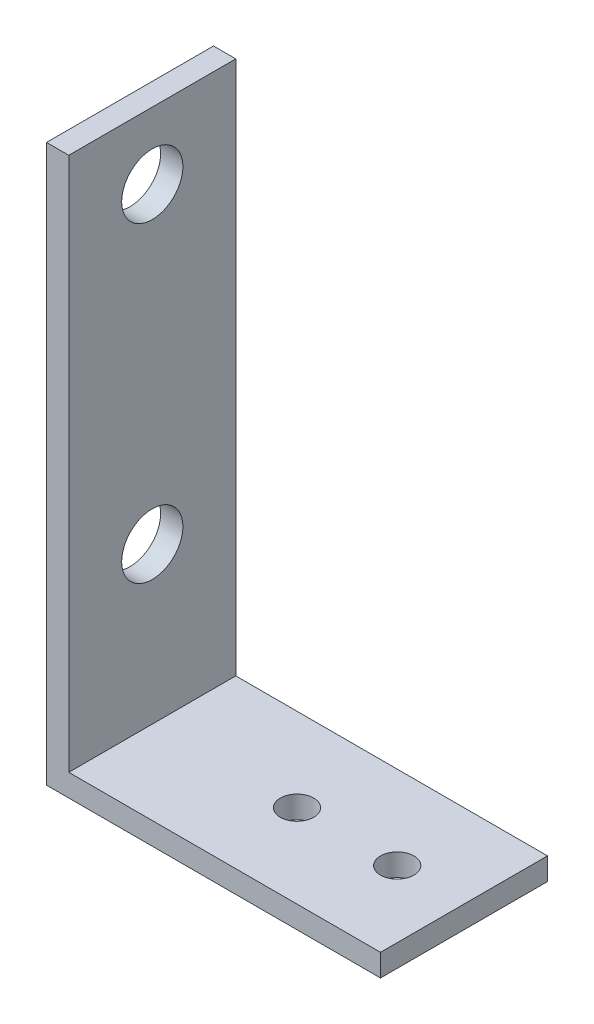
ISO-10303-21;
HEADER;
FILE_DESCRIPTION(('STEP AP214'),'2;1');
FILE_NAME('part.step','',(''),(''),'','','');
FILE_SCHEMA(('AUTOMOTIVE_DESIGN { 1 0 10303 214 1 1 1 1 }'));
ENDSEC;
DATA;
#1=APPLICATION_CONTEXT('core data for automotive mechanical design processes');
#2=APPLICATION_PROTOCOL_DEFINITION('international standard','automotive_design',2000,#1);
#3=PRODUCT_CONTEXT('',#1,'mechanical');
#4=PRODUCT('Part','Part','',(#3));
#5=PRODUCT_RELATED_PRODUCT_CATEGORY('part','',(#4));
#6=PRODUCT_DEFINITION_FORMATION('','',#4);
#7=PRODUCT_DEFINITION_CONTEXT('part definition',#1,'design');
#8=PRODUCT_DEFINITION('design','',#6,#7);
#9=PRODUCT_DEFINITION_SHAPE('','',#8);
#10=(LENGTH_UNIT() NAMED_UNIT(*) SI_UNIT(.MILLI.,.METRE.));
#11=(NAMED_UNIT(*) PLANE_ANGLE_UNIT() SI_UNIT($,.RADIAN.));
#12=(NAMED_UNIT(*) SI_UNIT($,.STERADIAN.) SOLID_ANGLE_UNIT());
#13=UNCERTAINTY_MEASURE_WITH_UNIT(LENGTH_MEASURE(1.E-05),#10,'distance_accuracy_value','');
#14=(GEOMETRIC_REPRESENTATION_CONTEXT(3) GLOBAL_UNCERTAINTY_ASSIGNED_CONTEXT((#13)) GLOBAL_UNIT_ASSIGNED_CONTEXT((#10,
#11,#12)) REPRESENTATION_CONTEXT('',''));
#15=CARTESIAN_POINT('',(0.,0.,0.));
#16=DIRECTION('',(0.,0.,1.));
#17=DIRECTION('',(1.,0.,0.));
#18=AXIS2_PLACEMENT_3D('',#15,#16,#17);
#19=CARTESIAN_POINT('',(0.,2.,15.));
#20=DIRECTION('',(-1.,0.,0.));
#21=DIRECTION('',(0.,-1.,0.));
#22=AXIS2_PLACEMENT_3D('',#19,#20,#21);
#23=PLANE('',#22);
#24=DIRECTION('',(0.,1.,0.));
#25=VECTOR('',#24,1.);
#26=CARTESIAN_POINT('',(0.,2.,0.));
#27=LINE('',#26,#25);
#28=CARTESIAN_POINT('',(0.,0.,0.));
#29=VERTEX_POINT('',#28);
#30=CARTESIAN_POINT('',(0.,2.,0.));
#31=VERTEX_POINT('',#30);
#32=EDGE_CURVE('E117',#29,#31,#27,.T.);
#33=ORIENTED_EDGE('',*,*,#32,.T.);
#34=DIRECTION('',(0.,0.,-1.));
#35=VECTOR('',#34,1.);
#36=CARTESIAN_POINT('',(0.,2.,15.));
#37=LINE('',#36,#35);
#38=CARTESIAN_POINT('',(0.,2.,15.));
#39=VERTEX_POINT('',#38);
#40=EDGE_CURVE('E11',#39,#31,#37,.T.);
#41=ORIENTED_EDGE('',*,*,#40,.F.);
#42=DIRECTION('',(0.,1.,0.));
#43=VECTOR('',#42,1.);
#44=CARTESIAN_POINT('',(0.,2.,15.));
#45=LINE('',#44,#43);
#46=CARTESIAN_POINT('',(0.,0.,15.));
#47=VERTEX_POINT('',#46);
#48=EDGE_CURVE('E128',#47,#39,#45,.T.);
#49=ORIENTED_EDGE('',*,*,#48,.F.);
#50=DIRECTION('',(0.,0.,-1.));
#51=VECTOR('',#50,1.);
#52=CARTESIAN_POINT('',(0.,0.,15.));
#53=LINE('',#52,#51);
#54=EDGE_CURVE('E113',#47,#29,#53,.T.);
#55=ORIENTED_EDGE('',*,*,#54,.T.);
#56=EDGE_LOOP('',(#33,#41,#49,#55));
#57=FACE_BOUND('',#56,.T.);
#58=ADVANCED_FACE('F33',(#57),#23,.F.);
#59=CARTESIAN_POINT('',(-28.,1.99999999999999,15.));
#60=DIRECTION('',(0.,-1.,0.));
#61=DIRECTION('',(1.,0.,0.));
#62=AXIS2_PLACEMENT_3D('',#59,#60,#61);
#63=PLANE('',#62);
#64=CARTESIAN_POINT('',(-15.,1.99999999999999,7.5));
#65=DIRECTION('',(0.,-1.,0.));
#66=DIRECTION('',(1.,0.,0.));
#67=AXIS2_PLACEMENT_3D('',#64,#65,#66);
#68=CIRCLE('',#67,1.5);
#69=CARTESIAN_POINT('',(-13.5,1.99999999999999,7.5));
#70=VERTEX_POINT('',#69);
#71=EDGE_CURVE('E250',#70,#70,#68,.T.);
#72=ORIENTED_EDGE('',*,*,#71,.T.);
#73=EDGE_LOOP('',(#72));
#74=FACE_BOUND('',#73,.T.);
#75=CARTESIAN_POINT('',(-6.,1.99999999999999,7.5));
#76=DIRECTION('',(0.,-1.,0.));
#77=DIRECTION('',(1.,0.,0.));
#78=AXIS2_PLACEMENT_3D('',#75,#76,#77);
#79=CIRCLE('',#78,1.5);
#80=CARTESIAN_POINT('',(-4.5,1.99999999999999,7.5));
#81=VERTEX_POINT('',#80);
#82=EDGE_CURVE('E254',#81,#81,#79,.T.);
#83=ORIENTED_EDGE('',*,*,#82,.T.);
#84=EDGE_LOOP('',(#83));
#85=FACE_BOUND('',#84,.T.);
#86=DIRECTION('',(-1.,0.,0.));
#87=VECTOR('',#86,1.);
#88=CARTESIAN_POINT('',(-28.,1.99999999999999,0.));
#89=LINE('',#88,#87);
#90=CARTESIAN_POINT('',(-28.,1.99999999999999,0.));
#91=VERTEX_POINT('',#90);
#92=EDGE_CURVE('E120',#31,#91,#89,.T.);
#93=ORIENTED_EDGE('',*,*,#92,.T.);
#94=DIRECTION('',(0.,0.,-1.));
#95=VECTOR('',#94,1.);
#96=CARTESIAN_POINT('',(-28.,1.99999999999999,15.));
#97=LINE('',#96,#95);
#98=CARTESIAN_POINT('',(-28.,1.99999999999999,15.));
#99=VERTEX_POINT('',#98);
#100=EDGE_CURVE('E41',#99,#91,#97,.T.);
#101=ORIENTED_EDGE('',*,*,#100,.F.);
#102=DIRECTION('',(-1.,0.,0.));
#103=VECTOR('',#102,1.);
#104=CARTESIAN_POINT('',(-28.,1.99999999999999,15.));
#105=LINE('',#104,#103);
#106=EDGE_CURVE('E86',#39,#99,#105,.T.);
#107=ORIENTED_EDGE('',*,*,#106,.F.);
#108=ORIENTED_EDGE('',*,*,#40,.T.);
#109=EDGE_LOOP('',(#93,#101,#107,#108));
#110=FACE_BOUND('',#109,.T.);
#111=ADVANCED_FACE('F156',(#74,#85,#110),#63,.F.);
#112=CARTESIAN_POINT('',(-28.,50.,15.));
#113=DIRECTION('',(-1.,0.,0.));
#114=DIRECTION('',(0.,-1.,0.));
#115=AXIS2_PLACEMENT_3D('',#112,#113,#114);
#116=PLANE('',#115);
#117=CARTESIAN_POINT('',(-28.,16.,7.50000000000001));
#118=DIRECTION('',(-1.,0.,0.));
#119=DIRECTION('',(0.,-1.,0.));
#120=AXIS2_PLACEMENT_3D('',#117,#118,#119);
#121=CIRCLE('',#120,2.75);
#122=CARTESIAN_POINT('',(-28.,13.25,7.50000000000001));
#123=VERTEX_POINT('',#122);
#124=EDGE_CURVE('E263',#123,#123,#121,.T.);
#125=ORIENTED_EDGE('',*,*,#124,.T.);
#126=EDGE_LOOP('',(#125));
#127=FACE_BOUND('',#126,.T.);
#128=CARTESIAN_POINT('',(-28.,44.,7.5));
#129=DIRECTION('',(-1.,0.,0.));
#130=DIRECTION('',(0.,-1.,0.));
#131=AXIS2_PLACEMENT_3D('',#128,#129,#130);
#132=CIRCLE('',#131,2.75);
#133=CARTESIAN_POINT('',(-28.,41.25,7.5));
#134=VERTEX_POINT('',#133);
#135=EDGE_CURVE('E121',#134,#134,#132,.T.);
#136=ORIENTED_EDGE('',*,*,#135,.T.);
#137=EDGE_LOOP('',(#136));
#138=FACE_BOUND('',#137,.T.);
#139=DIRECTION('',(0.,1.,0.));
#140=VECTOR('',#139,1.);
#141=CARTESIAN_POINT('',(-28.,50.,0.));
#142=LINE('',#141,#140);
#143=CARTESIAN_POINT('',(-28.,50.,0.));
#144=VERTEX_POINT('',#143);
#145=EDGE_CURVE('E123',#91,#144,#142,.T.);
#146=ORIENTED_EDGE('',*,*,#145,.T.);
#147=DIRECTION('',(0.,0.,-1.));
#148=VECTOR('',#147,1.);
#149=CARTESIAN_POINT('',(-28.,50.,15.));
#150=LINE('',#149,#148);
#151=CARTESIAN_POINT('',(-28.,50.,15.));
#152=VERTEX_POINT('',#151);
#153=EDGE_CURVE('E108',#152,#144,#150,.T.);
#154=ORIENTED_EDGE('',*,*,#153,.F.);
#155=DIRECTION('',(0.,1.,0.));
#156=VECTOR('',#155,1.);
#157=CARTESIAN_POINT('',(-28.,50.,15.));
#158=LINE('',#157,#156);
#159=EDGE_CURVE('E99',#99,#152,#158,.T.);
#160=ORIENTED_EDGE('',*,*,#159,.F.);
#161=ORIENTED_EDGE('',*,*,#100,.T.);
#162=EDGE_LOOP('',(#146,#154,#160,#161));
#163=FACE_BOUND('',#162,.T.);
#164=ADVANCED_FACE('F134',(#127,#138,#163),#116,.F.);
#165=CARTESIAN_POINT('',(-30.,50.,15.));
#166=DIRECTION('',(0.,-1.,0.));
#167=DIRECTION('',(0.,0.,-1.));
#168=AXIS2_PLACEMENT_3D('',#165,#166,#167);
#169=PLANE('',#168);
#170=DIRECTION('',(-1.,0.,0.));
#171=VECTOR('',#170,1.);
#172=CARTESIAN_POINT('',(-30.,50.,0.));
#173=LINE('',#172,#171);
#174=CARTESIAN_POINT('',(-30.,50.,0.));
#175=VERTEX_POINT('',#174);
#176=EDGE_CURVE('E107',#144,#175,#173,.T.);
#177=ORIENTED_EDGE('',*,*,#176,.T.);
#178=DIRECTION('',(0.,0.,-1.));
#179=VECTOR('',#178,1.);
#180=CARTESIAN_POINT('',(-30.,50.,15.));
#181=LINE('',#180,#179);
#182=CARTESIAN_POINT('',(-30.,50.,15.));
#183=VERTEX_POINT('',#182);
#184=EDGE_CURVE('E104',#183,#175,#181,.T.);
#185=ORIENTED_EDGE('',*,*,#184,.F.);
#186=DIRECTION('',(-1.,0.,0.));
#187=VECTOR('',#186,1.);
#188=CARTESIAN_POINT('',(-30.,50.,15.));
#189=LINE('',#188,#187);
#190=EDGE_CURVE('E93',#152,#183,#189,.T.);
#191=ORIENTED_EDGE('',*,*,#190,.F.);
#192=ORIENTED_EDGE('',*,*,#153,.T.);
#193=EDGE_LOOP('',(#177,#185,#191,#192));
#194=FACE_BOUND('',#193,.T.);
#195=ADVANCED_FACE('F105',(#194),#169,.F.);
#196=CARTESIAN_POINT('',(-30.,0.,15.));
#197=DIRECTION('',(1.,0.,0.));
#198=DIRECTION('',(0.,0.,-1.));
#199=AXIS2_PLACEMENT_3D('',#196,#197,#198);
#200=PLANE('',#199);
#201=CARTESIAN_POINT('',(-30.,16.,7.50000000000001));
#202=DIRECTION('',(-1.,0.,0.));
#203=DIRECTION('',(0.,0.,1.));
#204=AXIS2_PLACEMENT_3D('',#201,#202,#203);
#205=CIRCLE('',#204,2.75);
#206=CARTESIAN_POINT('',(-30.,16.,10.25));
#207=VERTEX_POINT('',#206);
#208=EDGE_CURVE('E260',#207,#207,#205,.T.);
#209=ORIENTED_EDGE('',*,*,#208,.F.);
#210=EDGE_LOOP('',(#209));
#211=FACE_BOUND('',#210,.T.);
#212=CARTESIAN_POINT('',(-30.,44.,7.5));
#213=DIRECTION('',(-1.,0.,0.));
#214=DIRECTION('',(0.,0.,1.));
#215=AXIS2_PLACEMENT_3D('',#212,#213,#214);
#216=CIRCLE('',#215,2.75);
#217=CARTESIAN_POINT('',(-30.,44.,10.25));
#218=VERTEX_POINT('',#217);
#219=EDGE_CURVE('E266',#218,#218,#216,.T.);
#220=ORIENTED_EDGE('',*,*,#219,.F.);
#221=EDGE_LOOP('',(#220));
#222=FACE_BOUND('',#221,.T.);
#223=DIRECTION('',(0.,-1.,0.));
#224=VECTOR('',#223,1.);
#225=CARTESIAN_POINT('',(-30.,0.,0.));
#226=LINE('',#225,#224);
#227=CARTESIAN_POINT('',(-30.,0.,0.));
#228=VERTEX_POINT('',#227);
#229=EDGE_CURVE('E72',#175,#228,#226,.T.);
#230=ORIENTED_EDGE('',*,*,#229,.T.);
#231=DIRECTION('',(0.,0.,-1.));
#232=VECTOR('',#231,1.);
#233=CARTESIAN_POINT('',(-30.,0.,15.));
#234=LINE('',#233,#232);
#235=CARTESIAN_POINT('',(-30.,0.,15.));
#236=VERTEX_POINT('',#235);
#237=EDGE_CURVE('E109',#236,#228,#234,.T.);
#238=ORIENTED_EDGE('',*,*,#237,.F.);
#239=DIRECTION('',(0.,-1.,0.));
#240=VECTOR('',#239,1.);
#241=CARTESIAN_POINT('',(-30.,0.,15.));
#242=LINE('',#241,#240);
#243=EDGE_CURVE('E97',#183,#236,#242,.T.);
#244=ORIENTED_EDGE('',*,*,#243,.F.);
#245=ORIENTED_EDGE('',*,*,#184,.T.);
#246=EDGE_LOOP('',(#230,#238,#244,#245));
#247=FACE_BOUND('',#246,.T.);
#248=ADVANCED_FACE('F111',(#211,#222,#247),#200,.F.);
#249=CARTESIAN_POINT('',(0.,0.,15.));
#250=DIRECTION('',(0.,1.,0.));
#251=DIRECTION('',(-1.,0.,0.));
#252=AXIS2_PLACEMENT_3D('',#249,#250,#251);
#253=PLANE('',#252);
#254=CARTESIAN_POINT('',(-15.,0.,7.5));
#255=DIRECTION('',(0.,-1.,0.));
#256=DIRECTION('',(1.,0.,0.));
#257=AXIS2_PLACEMENT_3D('',#254,#255,#256);
#258=CIRCLE('',#257,1.5);
#259=CARTESIAN_POINT('',(-13.5,0.,7.5));
#260=VERTEX_POINT('',#259);
#261=EDGE_CURVE('E248',#260,#260,#258,.T.);
#262=ORIENTED_EDGE('',*,*,#261,.F.);
#263=EDGE_LOOP('',(#262));
#264=FACE_BOUND('',#263,.T.);
#265=CARTESIAN_POINT('',(-6.,0.,7.5));
#266=DIRECTION('',(0.,-1.,0.));
#267=DIRECTION('',(1.,0.,0.));
#268=AXIS2_PLACEMENT_3D('',#265,#266,#267);
#269=CIRCLE('',#268,1.5);
#270=CARTESIAN_POINT('',(-4.5,0.,7.5));
#271=VERTEX_POINT('',#270);
#272=EDGE_CURVE('E251',#271,#271,#269,.T.);
#273=ORIENTED_EDGE('',*,*,#272,.F.);
#274=EDGE_LOOP('',(#273));
#275=FACE_BOUND('',#274,.T.);
#276=DIRECTION('',(1.,0.,0.));
#277=VECTOR('',#276,1.);
#278=CARTESIAN_POINT('',(0.,0.,0.));
#279=LINE('',#278,#277);
#280=EDGE_CURVE('E78',#228,#29,#279,.T.);
#281=ORIENTED_EDGE('',*,*,#280,.T.);
#282=ORIENTED_EDGE('',*,*,#54,.F.);
#283=DIRECTION('',(1.,0.,0.));
#284=VECTOR('',#283,1.);
#285=CARTESIAN_POINT('',(0.,0.,15.));
#286=LINE('',#285,#284);
#287=EDGE_CURVE('E49',#236,#47,#286,.T.);
#288=ORIENTED_EDGE('',*,*,#287,.F.);
#289=ORIENTED_EDGE('',*,*,#237,.T.);
#290=EDGE_LOOP('',(#281,#282,#288,#289));
#291=FACE_BOUND('',#290,.T.);
#292=ADVANCED_FACE('F141',(#264,#275,#291),#253,.F.);
#293=CARTESIAN_POINT('',(0.,0.,15.));
#294=DIRECTION('',(0.,0.,-1.));
#295=DIRECTION('',(-1.,0.,0.));
#296=AXIS2_PLACEMENT_3D('',#293,#294,#295);
#297=PLANE('',#296);
#298=ORIENTED_EDGE('',*,*,#48,.T.);
#299=ORIENTED_EDGE('',*,*,#106,.T.);
#300=ORIENTED_EDGE('',*,*,#159,.T.);
#301=ORIENTED_EDGE('',*,*,#190,.T.);
#302=ORIENTED_EDGE('',*,*,#243,.T.);
#303=ORIENTED_EDGE('',*,*,#287,.T.);
#304=EDGE_LOOP('',(#298,#299,#300,#301,#302,#303));
#305=FACE_BOUND('',#304,.T.);
#306=ADVANCED_FACE('F95',(#305),#297,.F.);
#307=CARTESIAN_POINT('',(0.,0.,0.));
#308=DIRECTION('',(0.,0.,-1.));
#309=DIRECTION('',(-1.,0.,0.));
#310=AXIS2_PLACEMENT_3D('',#307,#308,#309);
#311=PLANE('',#310);
#312=ORIENTED_EDGE('',*,*,#32,.F.);
#313=ORIENTED_EDGE('',*,*,#280,.F.);
#314=ORIENTED_EDGE('',*,*,#229,.F.);
#315=ORIENTED_EDGE('',*,*,#176,.F.);
#316=ORIENTED_EDGE('',*,*,#145,.F.);
#317=ORIENTED_EDGE('',*,*,#92,.F.);
#318=EDGE_LOOP('',(#312,#313,#314,#315,#316,#317));
#319=FACE_BOUND('',#318,.T.);
#320=ADVANCED_FACE('F137',(#319),#311,.T.);
#321=CARTESIAN_POINT('',(-15.,44.,7.5));
#322=DIRECTION('',(-1.,0.,0.));
#323=DIRECTION('',(0.,0.,1.));
#324=AXIS2_PLACEMENT_3D('',#321,#322,#323);
#325=CYLINDRICAL_SURFACE('',#324,2.75);
#326=ORIENTED_EDGE('',*,*,#219,.T.);
#327=EDGE_LOOP('',(#326));
#328=FACE_BOUND('',#327,.T.);
#329=ORIENTED_EDGE('',*,*,#135,.F.);
#330=EDGE_LOOP('',(#329));
#331=FACE_BOUND('',#330,.T.);
#332=ADVANCED_FACE('F188',(#328,#331),#325,.F.);
#333=CARTESIAN_POINT('',(-15.,16.,7.50000000000001));
#334=DIRECTION('',(-1.,0.,0.));
#335=DIRECTION('',(0.,0.,1.));
#336=AXIS2_PLACEMENT_3D('',#333,#334,#335);
#337=CYLINDRICAL_SURFACE('',#336,2.75);
#338=ORIENTED_EDGE('',*,*,#208,.T.);
#339=EDGE_LOOP('',(#338));
#340=FACE_BOUND('',#339,.T.);
#341=ORIENTED_EDGE('',*,*,#124,.F.);
#342=EDGE_LOOP('',(#341));
#343=FACE_BOUND('',#342,.T.);
#344=ADVANCED_FACE('F193',(#340,#343),#337,.F.);
#345=CARTESIAN_POINT('',(-6.,15.,7.5));
#346=DIRECTION('',(0.,-1.,0.));
#347=DIRECTION('',(1.,0.,0.));
#348=AXIS2_PLACEMENT_3D('',#345,#346,#347);
#349=CYLINDRICAL_SURFACE('',#348,1.5);
#350=ORIENTED_EDGE('',*,*,#272,.T.);
#351=EDGE_LOOP('',(#350));
#352=FACE_BOUND('',#351,.T.);
#353=ORIENTED_EDGE('',*,*,#82,.F.);
#354=EDGE_LOOP('',(#353));
#355=FACE_BOUND('',#354,.T.);
#356=ADVANCED_FACE('F204',(#352,#355),#349,.F.);
#357=CARTESIAN_POINT('',(-15.,15.,7.5));
#358=DIRECTION('',(0.,-1.,0.));
#359=DIRECTION('',(1.,0.,0.));
#360=AXIS2_PLACEMENT_3D('',#357,#358,#359);
#361=CYLINDRICAL_SURFACE('',#360,1.5);
#362=ORIENTED_EDGE('',*,*,#261,.T.);
#363=EDGE_LOOP('',(#362));
#364=FACE_BOUND('',#363,.T.);
#365=ORIENTED_EDGE('',*,*,#71,.F.);
#366=EDGE_LOOP('',(#365));
#367=FACE_BOUND('',#366,.T.);
#368=ADVANCED_FACE('F224',(#364,#367),#361,.F.);
#369=CLOSED_SHELL('',(#58,#111,#164,#195,#248,#292,#306,#320,#332,#344,#356,#368));
#370=MANIFOLD_SOLID_BREP('B2',#369);
#371=ADVANCED_BREP_SHAPE_REPRESENTATION('',(#18,#370),#14);
#372=SHAPE_DEFINITION_REPRESENTATION(#9,#371);
ENDSEC;
END-ISO-10303-21;
